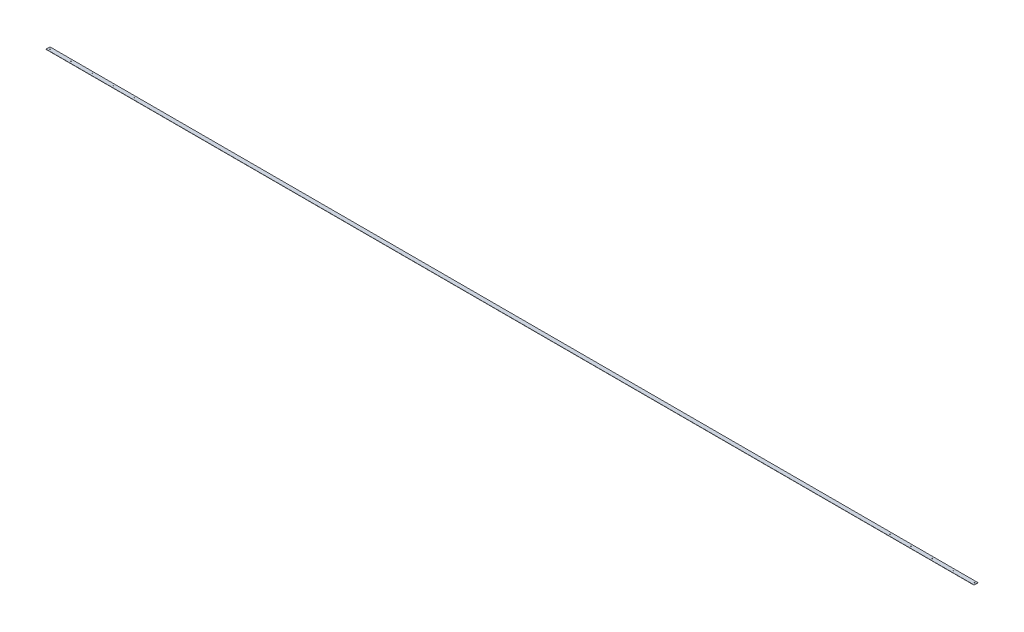
ISO-10303-21;
HEADER;
FILE_DESCRIPTION(('STEP AP214'),'2;1');
FILE_NAME('part.step','',(''),(''),'','','');
FILE_SCHEMA(('AUTOMOTIVE_DESIGN { 1 0 10303 214 1 1 1 1 }'));
ENDSEC;
DATA;
#1=APPLICATION_CONTEXT('core data for automotive mechanical design processes');
#2=APPLICATION_PROTOCOL_DEFINITION('international standard','automotive_design',2000,#1);
#3=PRODUCT_CONTEXT('',#1,'mechanical');
#4=PRODUCT('Part','Part','',(#3));
#5=PRODUCT_RELATED_PRODUCT_CATEGORY('part','',(#4));
#6=PRODUCT_DEFINITION_FORMATION('','',#4);
#7=PRODUCT_DEFINITION_CONTEXT('part definition',#1,'design');
#8=PRODUCT_DEFINITION('design','',#6,#7);
#9=PRODUCT_DEFINITION_SHAPE('','',#8);
#10=(LENGTH_UNIT() NAMED_UNIT(*) SI_UNIT(.MILLI.,.METRE.));
#11=(NAMED_UNIT(*) PLANE_ANGLE_UNIT() SI_UNIT($,.RADIAN.));
#12=(NAMED_UNIT(*) SI_UNIT($,.STERADIAN.) SOLID_ANGLE_UNIT());
#13=UNCERTAINTY_MEASURE_WITH_UNIT(LENGTH_MEASURE(1.E-05),#10,'distance_accuracy_value','');
#14=(GEOMETRIC_REPRESENTATION_CONTEXT(3) GLOBAL_UNCERTAINTY_ASSIGNED_CONTEXT((#13)) GLOBAL_UNIT_ASSIGNED_CONTEXT((#10,
#11,#12)) REPRESENTATION_CONTEXT('',''));
#15=CARTESIAN_POINT('',(0.,0.,0.));
#16=DIRECTION('',(0.,0.,1.));
#17=DIRECTION('',(1.,0.,0.));
#18=AXIS2_PLACEMENT_3D('',#15,#16,#17);
#19=CARTESIAN_POINT('',(-4679.25,2.,20.0000000000006));
#20=DIRECTION('',(1.,0.,0.));
#21=DIRECTION('',(0.,0.,-1.));
#22=AXIS2_PLACEMENT_3D('',#19,#20,#21);
#23=PLANE('',#22);
#24=DIRECTION('',(0.,0.,1.));
#25=VECTOR('',#24,1.);
#26=CARTESIAN_POINT('',(-4679.25,0.,20.0000000000006));
#27=LINE('',#26,#25);
#28=CARTESIAN_POINT('',(-4679.25,0.,-19.9999999999994));
#29=VERTEX_POINT('',#28);
#30=CARTESIAN_POINT('',(-4679.25,0.,20.0000000000006));
#31=VERTEX_POINT('',#30);
#32=EDGE_CURVE('E101',#29,#31,#27,.T.);
#33=ORIENTED_EDGE('',*,*,#32,.T.);
#34=DIRECTION('',(0.,-1.,0.));
#35=VECTOR('',#34,1.);
#36=CARTESIAN_POINT('',(-4679.25,2.,20.0000000000006));
#37=LINE('',#36,#35);
#38=CARTESIAN_POINT('',(-4679.25,2.,20.0000000000006));
#39=VERTEX_POINT('',#38);
#40=EDGE_CURVE('E11',#39,#31,#37,.T.);
#41=ORIENTED_EDGE('',*,*,#40,.F.);
#42=DIRECTION('',(0.,0.,1.));
#43=VECTOR('',#42,1.);
#44=CARTESIAN_POINT('',(-4679.25,2.,20.0000000000006));
#45=LINE('',#44,#43);
#46=CARTESIAN_POINT('',(-4679.25,2.,-19.9999999999994));
#47=VERTEX_POINT('',#46);
#48=EDGE_CURVE('E88',#47,#39,#45,.T.);
#49=ORIENTED_EDGE('',*,*,#48,.F.);
#50=DIRECTION('',(0.,-1.,0.));
#51=VECTOR('',#50,1.);
#52=CARTESIAN_POINT('',(-4679.25,2.,-19.9999999999994));
#53=LINE('',#52,#51);
#54=EDGE_CURVE('E97',#47,#29,#53,.T.);
#55=ORIENTED_EDGE('',*,*,#54,.T.);
#56=EDGE_LOOP('',(#33,#41,#49,#55));
#57=FACE_BOUND('',#56,.T.);
#58=ADVANCED_FACE('F35',(#57),#23,.F.);
#59=CARTESIAN_POINT('',(4679.25,2.,19.9999999999994));
#60=DIRECTION('',(0.,0.,-1.));
#61=DIRECTION('',(-1.,0.,0.));
#62=AXIS2_PLACEMENT_3D('',#59,#60,#61);
#63=PLANE('',#62);
#64=DIRECTION('',(1.,0.,0.));
#65=VECTOR('',#64,1.);
#66=CARTESIAN_POINT('',(4679.25,0.,19.9999999999994));
#67=LINE('',#66,#65);
#68=CARTESIAN_POINT('',(4679.25,0.,19.9999999999994));
#69=VERTEX_POINT('',#68);
#70=EDGE_CURVE('E92',#31,#69,#67,.T.);
#71=ORIENTED_EDGE('',*,*,#70,.T.);
#72=DIRECTION('',(0.,-1.,0.));
#73=VECTOR('',#72,1.);
#74=CARTESIAN_POINT('',(4679.25,2.,19.9999999999994));
#75=LINE('',#74,#73);
#76=CARTESIAN_POINT('',(4679.25,2.,19.9999999999994));
#77=VERTEX_POINT('',#76);
#78=EDGE_CURVE('E44',#77,#69,#75,.T.);
#79=ORIENTED_EDGE('',*,*,#78,.F.);
#80=DIRECTION('',(1.,0.,0.));
#81=VECTOR('',#80,1.);
#82=CARTESIAN_POINT('',(4679.25,2.,19.9999999999994));
#83=LINE('',#82,#81);
#84=EDGE_CURVE('E83',#39,#77,#83,.T.);
#85=ORIENTED_EDGE('',*,*,#84,.F.);
#86=ORIENTED_EDGE('',*,*,#40,.T.);
#87=EDGE_LOOP('',(#71,#79,#85,#86));
#88=FACE_BOUND('',#87,.T.);
#89=ADVANCED_FACE('F91',(#88),#63,.F.);
#90=CARTESIAN_POINT('',(4679.25,2.,19.9999999999994));
#91=DIRECTION('',(-1.,0.,0.));
#92=DIRECTION('',(0.,0.,1.));
#93=AXIS2_PLACEMENT_3D('',#90,#91,#92);
#94=PLANE('',#93);
#95=DIRECTION('',(0.,0.,-1.));
#96=VECTOR('',#95,1.);
#97=CARTESIAN_POINT('',(4679.25,0.,19.9999999999994));
#98=LINE('',#97,#96);
#99=CARTESIAN_POINT('',(4679.25,0.,-20.0000000000006));
#100=VERTEX_POINT('',#99);
#101=EDGE_CURVE('E70',#69,#100,#98,.T.);
#102=ORIENTED_EDGE('',*,*,#101,.T.);
#103=DIRECTION('',(0.,-1.,0.));
#104=VECTOR('',#103,1.);
#105=CARTESIAN_POINT('',(4679.25,2.,-20.0000000000006));
#106=LINE('',#105,#104);
#107=CARTESIAN_POINT('',(4679.25,2.,-20.0000000000006));
#108=VERTEX_POINT('',#107);
#109=EDGE_CURVE('E93',#108,#100,#106,.T.);
#110=ORIENTED_EDGE('',*,*,#109,.F.);
#111=DIRECTION('',(0.,0.,-1.));
#112=VECTOR('',#111,1.);
#113=CARTESIAN_POINT('',(4679.25,2.,19.9999999999994));
#114=LINE('',#113,#112);
#115=EDGE_CURVE('E86',#77,#108,#114,.T.);
#116=ORIENTED_EDGE('',*,*,#115,.F.);
#117=ORIENTED_EDGE('',*,*,#78,.T.);
#118=EDGE_LOOP('',(#102,#110,#116,#117));
#119=FACE_BOUND('',#118,.T.);
#120=ADVANCED_FACE('F95',(#119),#94,.F.);
#121=CARTESIAN_POINT('',(4679.25,2.,-20.0000000000006));
#122=DIRECTION('',(0.,0.,1.));
#123=DIRECTION('',(1.,0.,0.));
#124=AXIS2_PLACEMENT_3D('',#121,#122,#123);
#125=PLANE('',#124);
#126=DIRECTION('',(-1.,0.,0.));
#127=VECTOR('',#126,1.);
#128=CARTESIAN_POINT('',(4679.25,0.,-20.0000000000006));
#129=LINE('',#128,#127);
#130=EDGE_CURVE('E76',#100,#29,#129,.T.);
#131=ORIENTED_EDGE('',*,*,#130,.T.);
#132=ORIENTED_EDGE('',*,*,#54,.F.);
#133=DIRECTION('',(-1.,0.,0.));
#134=VECTOR('',#133,1.);
#135=CARTESIAN_POINT('',(4679.25,2.,-20.0000000000006));
#136=LINE('',#135,#134);
#137=EDGE_CURVE('E53',#108,#47,#136,.T.);
#138=ORIENTED_EDGE('',*,*,#137,.F.);
#139=ORIENTED_EDGE('',*,*,#109,.T.);
#140=EDGE_LOOP('',(#131,#132,#138,#139));
#141=FACE_BOUND('',#140,.T.);
#142=ADVANCED_FACE('F171',(#141),#125,.F.);
#143=CARTESIAN_POINT('',(0.,2.,0.));
#144=DIRECTION('',(0.,1.,0.));
#145=DIRECTION('',(0.,0.,1.));
#146=AXIS2_PLACEMENT_3D('',#143,#144,#145);
#147=PLANE('',#146);
#148=CARTESIAN_POINT('',(-4659.25,2.,5.72458747072346E-13));
#149=DIRECTION('',(0.,1.,0.));
#150=DIRECTION('',(0.,0.,1.));
#151=AXIS2_PLACEMENT_3D('',#148,#149,#150);
#152=CIRCLE('',#151,3.40000000000035);
#153=CARTESIAN_POINT('',(-4659.25,2.,3.40000000000092));
#154=VERTEX_POINT('',#153);
#155=EDGE_CURVE('E113',#154,#154,#152,.T.);
#156=ORIENTED_EDGE('',*,*,#155,.F.);
#157=EDGE_LOOP('',(#156));
#158=FACE_BOUND('',#157,.T.);
#159=CARTESIAN_POINT('',(3812.25,2.,6.50797702310567E-12));
#160=DIRECTION('',(0.,1.,0.));
#161=DIRECTION('',(0.,0.,1.));
#162=AXIS2_PLACEMENT_3D('',#159,#160,#161);
#163=CIRCLE('',#162,3.40000000000039);
#164=CARTESIAN_POINT('',(3812.25,2.,3.4000000000069));
#165=VERTEX_POINT('',#164);
#166=EDGE_CURVE('E311',#165,#165,#163,.T.);
#167=ORIENTED_EDGE('',*,*,#166,.F.);
#168=EDGE_LOOP('',(#167));
#169=FACE_BOUND('',#168,.T.);
#170=CARTESIAN_POINT('',(4024.75,2.,5.02409745409734E-12));
#171=DIRECTION('',(0.,1.,0.));
#172=DIRECTION('',(0.,0.,1.));
#173=AXIS2_PLACEMENT_3D('',#170,#171,#172);
#174=CIRCLE('',#173,3.40000000000035);
#175=CARTESIAN_POINT('',(4024.75,2.,3.40000000000537));
#176=VERTEX_POINT('',#175);
#177=EDGE_CURVE('E285',#176,#176,#174,.T.);
#178=ORIENTED_EDGE('',*,*,#177,.F.);
#179=EDGE_LOOP('',(#178));
#180=FACE_BOUND('',#179,.T.);
#181=CARTESIAN_POINT('',(4237.25,2.,3.54021788508901E-12));
#182=DIRECTION('',(0.,1.,0.));
#183=DIRECTION('',(0.,0.,1.));
#184=AXIS2_PLACEMENT_3D('',#181,#182,#183);
#185=CIRCLE('',#184,3.40000000000035);
#186=CARTESIAN_POINT('',(4237.25,2.,3.40000000000389));
#187=VERTEX_POINT('',#186);
#188=EDGE_CURVE('E310',#187,#187,#185,.T.);
#189=ORIENTED_EDGE('',*,*,#188,.F.);
#190=EDGE_LOOP('',(#189));
#191=FACE_BOUND('',#190,.T.);
#192=CARTESIAN_POINT('',(4449.75,2.,2.05633831608068E-12));
#193=DIRECTION('',(0.,1.,0.));
#194=DIRECTION('',(0.,0.,1.));
#195=AXIS2_PLACEMENT_3D('',#192,#193,#194);
#196=CIRCLE('',#195,3.40000000000035);
#197=CARTESIAN_POINT('',(4449.75,2.,3.40000000000241));
#198=VERTEX_POINT('',#197);
#199=EDGE_CURVE('E314',#198,#198,#196,.T.);
#200=ORIENTED_EDGE('',*,*,#199,.F.);
#201=EDGE_LOOP('',(#200));
#202=FACE_BOUND('',#201,.T.);
#203=CARTESIAN_POINT('',(4662.25,2.,5.72458747072346E-13));
#204=DIRECTION('',(0.,1.,0.));
#205=DIRECTION('',(0.,0.,1.));
#206=AXIS2_PLACEMENT_3D('',#203,#204,#205);
#207=CIRCLE('',#206,3.40000000000035);
#208=CARTESIAN_POINT('',(4662.25,2.,3.40000000000092));
#209=VERTEX_POINT('',#208);
#210=EDGE_CURVE('E321',#209,#209,#207,.T.);
#211=ORIENTED_EDGE('',*,*,#210,.F.);
#212=EDGE_LOOP('',(#211));
#213=FACE_BOUND('',#212,.T.);
#214=CARTESIAN_POINT('',(-3809.25,2.,5.72458747072346E-13));
#215=DIRECTION('',(0.,1.,0.));
#216=DIRECTION('',(0.,0.,1.));
#217=AXIS2_PLACEMENT_3D('',#214,#215,#216);
#218=CIRCLE('',#217,3.40000000000039);
#219=CARTESIAN_POINT('',(-3809.25,2.,3.40000000000096));
#220=VERTEX_POINT('',#219);
#221=EDGE_CURVE('E324',#220,#220,#218,.T.);
#222=ORIENTED_EDGE('',*,*,#221,.F.);
#223=EDGE_LOOP('',(#222));
#224=FACE_BOUND('',#223,.T.);
#225=CARTESIAN_POINT('',(-4021.75,2.,5.72458747072346E-13));
#226=DIRECTION('',(0.,1.,0.));
#227=DIRECTION('',(0.,0.,1.));
#228=AXIS2_PLACEMENT_3D('',#225,#226,#227);
#229=CIRCLE('',#228,3.40000000000035);
#230=CARTESIAN_POINT('',(-4021.75,2.,3.40000000000092));
#231=VERTEX_POINT('',#230);
#232=EDGE_CURVE('E327',#231,#231,#229,.T.);
#233=ORIENTED_EDGE('',*,*,#232,.F.);
#234=EDGE_LOOP('',(#233));
#235=FACE_BOUND('',#234,.T.);
#236=CARTESIAN_POINT('',(-4234.25,2.,5.72458747072346E-13));
#237=DIRECTION('',(0.,1.,0.));
#238=DIRECTION('',(0.,0.,1.));
#239=AXIS2_PLACEMENT_3D('',#236,#237,#238);
#240=CIRCLE('',#239,3.40000000000035);
#241=CARTESIAN_POINT('',(-4234.25,2.,3.40000000000092));
#242=VERTEX_POINT('',#241);
#243=EDGE_CURVE('E330',#242,#242,#240,.T.);
#244=ORIENTED_EDGE('',*,*,#243,.F.);
#245=EDGE_LOOP('',(#244));
#246=FACE_BOUND('',#245,.T.);
#247=CARTESIAN_POINT('',(-4446.75,2.,5.72458747072346E-13));
#248=DIRECTION('',(0.,1.,0.));
#249=DIRECTION('',(0.,0.,1.));
#250=AXIS2_PLACEMENT_3D('',#247,#248,#249);
#251=CIRCLE('',#250,3.40000000000035);
#252=CARTESIAN_POINT('',(-4446.75,2.,3.40000000000092));
#253=VERTEX_POINT('',#252);
#254=EDGE_CURVE('E333',#253,#253,#251,.T.);
#255=ORIENTED_EDGE('',*,*,#254,.F.);
#256=EDGE_LOOP('',(#255));
#257=FACE_BOUND('',#256,.T.);
#258=ORIENTED_EDGE('',*,*,#48,.T.);
#259=ORIENTED_EDGE('',*,*,#84,.T.);
#260=ORIENTED_EDGE('',*,*,#115,.T.);
#261=ORIENTED_EDGE('',*,*,#137,.T.);
#262=EDGE_LOOP('',(#258,#259,#260,#261));
#263=FACE_BOUND('',#262,.T.);
#264=ADVANCED_FACE('F84',(#158,#169,#180,#191,#202,#213,#224,#235,#246,#257,#263),#147,.T.);
#265=CARTESIAN_POINT('',(0.,0.,0.));
#266=DIRECTION('',(0.,1.,0.));
#267=DIRECTION('',(0.,0.,1.));
#268=AXIS2_PLACEMENT_3D('',#265,#266,#267);
#269=PLANE('',#268);
#270=CARTESIAN_POINT('',(-4659.25,0.,5.72458747072346E-13));
#271=DIRECTION('',(0.,1.,0.));
#272=DIRECTION('',(0.,0.,1.));
#273=AXIS2_PLACEMENT_3D('',#270,#271,#272);
#274=CIRCLE('',#273,3.40000000000035);
#275=CARTESIAN_POINT('',(-4659.25,0.,3.40000000000092));
#276=VERTEX_POINT('',#275);
#277=EDGE_CURVE('E38',#276,#276,#274,.T.);
#278=ORIENTED_EDGE('',*,*,#277,.T.);
#279=EDGE_LOOP('',(#278));
#280=FACE_BOUND('',#279,.T.);
#281=CARTESIAN_POINT('',(3812.25,0.,6.50797702310567E-12));
#282=DIRECTION('',(0.,1.,0.));
#283=DIRECTION('',(0.,0.,1.));
#284=AXIS2_PLACEMENT_3D('',#281,#282,#283);
#285=CIRCLE('',#284,3.40000000000039);
#286=CARTESIAN_POINT('',(3812.25,0.,3.4000000000069));
#287=VERTEX_POINT('',#286);
#288=EDGE_CURVE('E133',#287,#287,#285,.T.);
#289=ORIENTED_EDGE('',*,*,#288,.T.);
#290=EDGE_LOOP('',(#289));
#291=FACE_BOUND('',#290,.T.);
#292=CARTESIAN_POINT('',(4024.75,0.,5.02409745409734E-12));
#293=DIRECTION('',(0.,1.,0.));
#294=DIRECTION('',(0.,0.,1.));
#295=AXIS2_PLACEMENT_3D('',#292,#293,#294);
#296=CIRCLE('',#295,3.40000000000035);
#297=CARTESIAN_POINT('',(4024.75,0.,3.40000000000537));
#298=VERTEX_POINT('',#297);
#299=EDGE_CURVE('E131',#298,#298,#296,.T.);
#300=ORIENTED_EDGE('',*,*,#299,.T.);
#301=EDGE_LOOP('',(#300));
#302=FACE_BOUND('',#301,.T.);
#303=CARTESIAN_POINT('',(4237.25,0.,3.54021788508901E-12));
#304=DIRECTION('',(0.,1.,0.));
#305=DIRECTION('',(0.,0.,1.));
#306=AXIS2_PLACEMENT_3D('',#303,#304,#305);
#307=CIRCLE('',#306,3.40000000000035);
#308=CARTESIAN_POINT('',(4237.25,0.,3.40000000000389));
#309=VERTEX_POINT('',#308);
#310=EDGE_CURVE('E128',#309,#309,#307,.T.);
#311=ORIENTED_EDGE('',*,*,#310,.T.);
#312=EDGE_LOOP('',(#311));
#313=FACE_BOUND('',#312,.T.);
#314=CARTESIAN_POINT('',(4449.75,0.,2.05633831608068E-12));
#315=DIRECTION('',(0.,1.,0.));
#316=DIRECTION('',(0.,0.,1.));
#317=AXIS2_PLACEMENT_3D('',#314,#315,#316);
#318=CIRCLE('',#317,3.40000000000035);
#319=CARTESIAN_POINT('',(4449.75,0.,3.40000000000241));
#320=VERTEX_POINT('',#319);
#321=EDGE_CURVE('E125',#320,#320,#318,.T.);
#322=ORIENTED_EDGE('',*,*,#321,.T.);
#323=EDGE_LOOP('',(#322));
#324=FACE_BOUND('',#323,.T.);
#325=CARTESIAN_POINT('',(4662.25,0.,5.72458747072346E-13));
#326=DIRECTION('',(0.,1.,0.));
#327=DIRECTION('',(0.,0.,1.));
#328=AXIS2_PLACEMENT_3D('',#325,#326,#327);
#329=CIRCLE('',#328,3.40000000000035);
#330=CARTESIAN_POINT('',(4662.25,0.,3.40000000000092));
#331=VERTEX_POINT('',#330);
#332=EDGE_CURVE('E122',#331,#331,#329,.T.);
#333=ORIENTED_EDGE('',*,*,#332,.T.);
#334=EDGE_LOOP('',(#333));
#335=FACE_BOUND('',#334,.T.);
#336=CARTESIAN_POINT('',(-3809.25,0.,5.72458747072346E-13));
#337=DIRECTION('',(0.,1.,0.));
#338=DIRECTION('',(0.,0.,1.));
#339=AXIS2_PLACEMENT_3D('',#336,#337,#338);
#340=CIRCLE('',#339,3.40000000000039);
#341=CARTESIAN_POINT('',(-3809.25,0.,3.40000000000096));
#342=VERTEX_POINT('',#341);
#343=EDGE_CURVE('E119',#342,#342,#340,.T.);
#344=ORIENTED_EDGE('',*,*,#343,.T.);
#345=EDGE_LOOP('',(#344));
#346=FACE_BOUND('',#345,.T.);
#347=CARTESIAN_POINT('',(-4021.75,0.,5.72458747072346E-13));
#348=DIRECTION('',(0.,1.,0.));
#349=DIRECTION('',(0.,0.,1.));
#350=AXIS2_PLACEMENT_3D('',#347,#348,#349);
#351=CIRCLE('',#350,3.40000000000035);
#352=CARTESIAN_POINT('',(-4021.75,0.,3.40000000000092));
#353=VERTEX_POINT('',#352);
#354=EDGE_CURVE('E116',#353,#353,#351,.T.);
#355=ORIENTED_EDGE('',*,*,#354,.T.);
#356=EDGE_LOOP('',(#355));
#357=FACE_BOUND('',#356,.T.);
#358=CARTESIAN_POINT('',(-4234.25,0.,5.72458747072346E-13));
#359=DIRECTION('',(0.,1.,0.));
#360=DIRECTION('',(0.,0.,1.));
#361=AXIS2_PLACEMENT_3D('',#358,#359,#360);
#362=CIRCLE('',#361,3.40000000000035);
#363=CARTESIAN_POINT('',(-4234.25,0.,3.40000000000092));
#364=VERTEX_POINT('',#363);
#365=EDGE_CURVE('E112',#364,#364,#362,.T.);
#366=ORIENTED_EDGE('',*,*,#365,.T.);
#367=EDGE_LOOP('',(#366));
#368=FACE_BOUND('',#367,.T.);
#369=CARTESIAN_POINT('',(-4446.75,0.,5.72458747072346E-13));
#370=DIRECTION('',(0.,1.,0.));
#371=DIRECTION('',(0.,0.,1.));
#372=AXIS2_PLACEMENT_3D('',#369,#370,#371);
#373=CIRCLE('',#372,3.40000000000035);
#374=CARTESIAN_POINT('',(-4446.75,0.,3.40000000000092));
#375=VERTEX_POINT('',#374);
#376=EDGE_CURVE('E109',#375,#375,#373,.T.);
#377=ORIENTED_EDGE('',*,*,#376,.T.);
#378=EDGE_LOOP('',(#377));
#379=FACE_BOUND('',#378,.T.);
#380=ORIENTED_EDGE('',*,*,#32,.F.);
#381=ORIENTED_EDGE('',*,*,#130,.F.);
#382=ORIENTED_EDGE('',*,*,#101,.F.);
#383=ORIENTED_EDGE('',*,*,#70,.F.);
#384=EDGE_LOOP('',(#380,#381,#382,#383));
#385=FACE_BOUND('',#384,.T.);
#386=ADVANCED_FACE('F140',(#280,#291,#302,#313,#324,#335,#346,#357,#368,#379,#385),#269,.F.);
#387=CARTESIAN_POINT('',(-4446.75,-8.,5.72458747072346E-13));
#388=DIRECTION('',(0.,1.,0.));
#389=DIRECTION('',(0.,0.,1.));
#390=AXIS2_PLACEMENT_3D('',#387,#388,#389);
#391=CYLINDRICAL_SURFACE('',#390,3.40000000000035);
#392=ORIENTED_EDGE('',*,*,#254,.T.);
#393=EDGE_LOOP('',(#392));
#394=FACE_BOUND('',#393,.T.);
#395=ORIENTED_EDGE('',*,*,#376,.F.);
#396=EDGE_LOOP('',(#395));
#397=FACE_BOUND('',#396,.T.);
#398=ADVANCED_FACE('F162',(#394,#397),#391,.F.);
#399=CARTESIAN_POINT('',(-4234.25,-8.,5.72458747072346E-13));
#400=DIRECTION('',(0.,1.,0.));
#401=DIRECTION('',(0.,0.,1.));
#402=AXIS2_PLACEMENT_3D('',#399,#400,#401);
#403=CYLINDRICAL_SURFACE('',#402,3.40000000000035);
#404=ORIENTED_EDGE('',*,*,#243,.T.);
#405=EDGE_LOOP('',(#404));
#406=FACE_BOUND('',#405,.T.);
#407=ORIENTED_EDGE('',*,*,#365,.F.);
#408=EDGE_LOOP('',(#407));
#409=FACE_BOUND('',#408,.T.);
#410=ADVANCED_FACE('F168',(#406,#409),#403,.F.);
#411=CARTESIAN_POINT('',(-4021.75,-8.,5.72458747072346E-13));
#412=DIRECTION('',(0.,1.,0.));
#413=DIRECTION('',(0.,0.,1.));
#414=AXIS2_PLACEMENT_3D('',#411,#412,#413);
#415=CYLINDRICAL_SURFACE('',#414,3.40000000000035);
#416=ORIENTED_EDGE('',*,*,#232,.T.);
#417=EDGE_LOOP('',(#416));
#418=FACE_BOUND('',#417,.T.);
#419=ORIENTED_EDGE('',*,*,#354,.F.);
#420=EDGE_LOOP('',(#419));
#421=FACE_BOUND('',#420,.T.);
#422=ADVANCED_FACE('F210',(#418,#421),#415,.F.);
#423=CARTESIAN_POINT('',(-3809.25,-8.,5.72458747072346E-13));
#424=DIRECTION('',(0.,1.,0.));
#425=DIRECTION('',(0.,0.,1.));
#426=AXIS2_PLACEMENT_3D('',#423,#424,#425);
#427=CYLINDRICAL_SURFACE('',#426,3.40000000000039);
#428=ORIENTED_EDGE('',*,*,#221,.T.);
#429=EDGE_LOOP('',(#428));
#430=FACE_BOUND('',#429,.T.);
#431=ORIENTED_EDGE('',*,*,#343,.F.);
#432=EDGE_LOOP('',(#431));
#433=FACE_BOUND('',#432,.T.);
#434=ADVANCED_FACE('F220',(#430,#433),#427,.F.);
#435=CARTESIAN_POINT('',(4662.25,-8.,5.72458747072346E-13));
#436=DIRECTION('',(0.,1.,0.));
#437=DIRECTION('',(0.,0.,1.));
#438=AXIS2_PLACEMENT_3D('',#435,#436,#437);
#439=CYLINDRICAL_SURFACE('',#438,3.40000000000035);
#440=ORIENTED_EDGE('',*,*,#210,.T.);
#441=EDGE_LOOP('',(#440));
#442=FACE_BOUND('',#441,.T.);
#443=ORIENTED_EDGE('',*,*,#332,.F.);
#444=EDGE_LOOP('',(#443));
#445=FACE_BOUND('',#444,.T.);
#446=ADVANCED_FACE('F230',(#442,#445),#439,.F.);
#447=CARTESIAN_POINT('',(4449.75,-8.,2.05633831608068E-12));
#448=DIRECTION('',(0.,1.,0.));
#449=DIRECTION('',(0.,0.,1.));
#450=AXIS2_PLACEMENT_3D('',#447,#448,#449);
#451=CYLINDRICAL_SURFACE('',#450,3.40000000000035);
#452=ORIENTED_EDGE('',*,*,#199,.T.);
#453=EDGE_LOOP('',(#452));
#454=FACE_BOUND('',#453,.T.);
#455=ORIENTED_EDGE('',*,*,#321,.F.);
#456=EDGE_LOOP('',(#455));
#457=FACE_BOUND('',#456,.T.);
#458=ADVANCED_FACE('F240',(#454,#457),#451,.F.);
#459=CARTESIAN_POINT('',(4237.25,-8.,3.54021788508901E-12));
#460=DIRECTION('',(0.,1.,0.));
#461=DIRECTION('',(0.,0.,1.));
#462=AXIS2_PLACEMENT_3D('',#459,#460,#461);
#463=CYLINDRICAL_SURFACE('',#462,3.40000000000035);
#464=ORIENTED_EDGE('',*,*,#188,.T.);
#465=EDGE_LOOP('',(#464));
#466=FACE_BOUND('',#465,.T.);
#467=ORIENTED_EDGE('',*,*,#310,.F.);
#468=EDGE_LOOP('',(#467));
#469=FACE_BOUND('',#468,.T.);
#470=ADVANCED_FACE('F250',(#466,#469),#463,.F.);
#471=CARTESIAN_POINT('',(4024.75,-8.,5.02409745409734E-12));
#472=DIRECTION('',(0.,1.,0.));
#473=DIRECTION('',(0.,0.,1.));
#474=AXIS2_PLACEMENT_3D('',#471,#472,#473);
#475=CYLINDRICAL_SURFACE('',#474,3.40000000000035);
#476=ORIENTED_EDGE('',*,*,#177,.T.);
#477=EDGE_LOOP('',(#476));
#478=FACE_BOUND('',#477,.T.);
#479=ORIENTED_EDGE('',*,*,#299,.F.);
#480=EDGE_LOOP('',(#479));
#481=FACE_BOUND('',#480,.T.);
#482=ADVANCED_FACE('F150',(#478,#481),#475,.F.);
#483=CARTESIAN_POINT('',(3812.25,-8.,6.50797702310567E-12));
#484=DIRECTION('',(0.,1.,0.));
#485=DIRECTION('',(0.,0.,1.));
#486=AXIS2_PLACEMENT_3D('',#483,#484,#485);
#487=CYLINDRICAL_SURFACE('',#486,3.40000000000039);
#488=ORIENTED_EDGE('',*,*,#166,.T.);
#489=EDGE_LOOP('',(#488));
#490=FACE_BOUND('',#489,.T.);
#491=ORIENTED_EDGE('',*,*,#288,.F.);
#492=EDGE_LOOP('',(#491));
#493=FACE_BOUND('',#492,.T.);
#494=ADVANCED_FACE('F144',(#490,#493),#487,.F.);
#495=CARTESIAN_POINT('',(-4659.25,-8.,5.72458747072346E-13));
#496=DIRECTION('',(0.,1.,0.));
#497=DIRECTION('',(0.,0.,1.));
#498=AXIS2_PLACEMENT_3D('',#495,#496,#497);
#499=CYLINDRICAL_SURFACE('',#498,3.40000000000035);
#500=ORIENTED_EDGE('',*,*,#155,.T.);
#501=EDGE_LOOP('',(#500));
#502=FACE_BOUND('',#501,.T.);
#503=ORIENTED_EDGE('',*,*,#277,.F.);
#504=EDGE_LOOP('',(#503));
#505=FACE_BOUND('',#504,.T.);
#506=ADVANCED_FACE('F142',(#502,#505),#499,.F.);
#507=CLOSED_SHELL('',(#58,#89,#120,#142,#264,#386,#398,#410,#422,#434,#446,#458,#470,#482,#494,#506));
#508=MANIFOLD_SOLID_BREP('B2',#507);
#509=ADVANCED_BREP_SHAPE_REPRESENTATION('',(#18,#508),#14);
#510=SHAPE_DEFINITION_REPRESENTATION(#9,#509);
ENDSEC;
END-ISO-10303-21;
